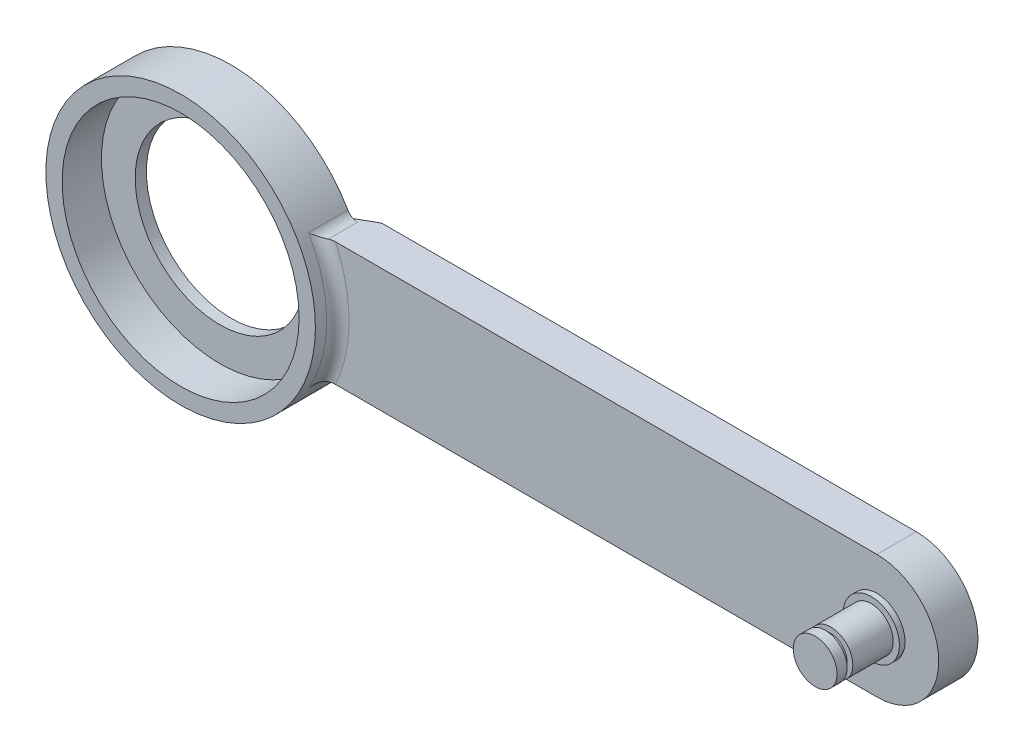
ISO-10303-21;
HEADER;
FILE_DESCRIPTION(('STEP AP214'),'2;1');
FILE_NAME('part.step','',(''),(''),'','','');
FILE_SCHEMA(('AUTOMOTIVE_DESIGN { 1 0 10303 214 1 1 1 1 }'));
ENDSEC;
DATA;
#1=APPLICATION_CONTEXT('core data for automotive mechanical design processes');
#2=APPLICATION_PROTOCOL_DEFINITION('international standard','automotive_design',2000,#1);
#3=PRODUCT_CONTEXT('',#1,'mechanical');
#4=PRODUCT('Part','Part','',(#3));
#5=PRODUCT_RELATED_PRODUCT_CATEGORY('part','',(#4));
#6=PRODUCT_DEFINITION_FORMATION('','',#4);
#7=PRODUCT_DEFINITION_CONTEXT('part definition',#1,'design');
#8=PRODUCT_DEFINITION('design','',#6,#7);
#9=PRODUCT_DEFINITION_SHAPE('','',#8);
#10=(LENGTH_UNIT() NAMED_UNIT(*) SI_UNIT(.MILLI.,.METRE.));
#11=(NAMED_UNIT(*) PLANE_ANGLE_UNIT() SI_UNIT($,.RADIAN.));
#12=(NAMED_UNIT(*) SI_UNIT($,.STERADIAN.) SOLID_ANGLE_UNIT());
#13=UNCERTAINTY_MEASURE_WITH_UNIT(LENGTH_MEASURE(1.E-05),#10,'distance_accuracy_value','');
#14=(GEOMETRIC_REPRESENTATION_CONTEXT(3) GLOBAL_UNCERTAINTY_ASSIGNED_CONTEXT((#13)) GLOBAL_UNIT_ASSIGNED_CONTEXT((#10,
#11,#12)) REPRESENTATION_CONTEXT('',''));
#15=CARTESIAN_POINT('',(0.,0.,0.));
#16=DIRECTION('',(0.,0.,1.));
#17=DIRECTION('',(1.,0.,0.));
#18=AXIS2_PLACEMENT_3D('',#15,#16,#17);
#19=CARTESIAN_POINT('',(120.,0.,16.));
#20=DIRECTION('',(0.,0.,-1.));
#21=DIRECTION('',(-1.,0.,0.));
#22=AXIS2_PLACEMENT_3D('',#19,#20,#21);
#23=CYLINDRICAL_SURFACE('',#22,3.9);
#24=CARTESIAN_POINT('',(120.,0.,6.));
#25=DIRECTION('',(0.,0.,1.));
#26=DIRECTION('',(1.,0.,0.));
#27=AXIS2_PLACEMENT_3D('',#24,#25,#26);
#28=CIRCLE('',#27,3.9);
#29=CARTESIAN_POINT('',(123.9,0.,6.));
#30=VERTEX_POINT('',#29);
#31=EDGE_CURVE('E11',#30,#30,#28,.T.);
#32=ORIENTED_EDGE('',*,*,#31,.T.);
#33=EDGE_LOOP('',(#32));
#34=FACE_BOUND('',#33,.T.);
#35=CARTESIAN_POINT('',(120.,0.,13.2));
#36=DIRECTION('',(0.,0.,1.));
#37=DIRECTION('',(1.,0.,0.));
#38=AXIS2_PLACEMENT_3D('',#35,#36,#37);
#39=CIRCLE('',#38,3.9);
#40=CARTESIAN_POINT('',(123.9,0.,13.2));
#41=VERTEX_POINT('',#40);
#42=EDGE_CURVE('E281',#41,#41,#39,.T.);
#43=ORIENTED_EDGE('',*,*,#42,.F.);
#44=EDGE_LOOP('',(#43));
#45=FACE_BOUND('',#44,.T.);
#46=ADVANCED_FACE('F38',(#34,#45),#23,.T.);
#47=CARTESIAN_POINT('',(120.,0.,0.));
#48=DIRECTION('',(0.,0.,1.));
#49=DIRECTION('',(1.,0.,0.));
#50=AXIS2_PLACEMENT_3D('',#47,#48,#49);
#51=PLANE('',#50);
#52=CARTESIAN_POINT('',(0.,0.,0.));
#53=DIRECTION('',(0.,0.,1.));
#54=DIRECTION('',(1.,0.,0.));
#55=AXIS2_PLACEMENT_3D('',#52,#53,#54);
#56=CIRCLE('',#55,15.1);
#57=CARTESIAN_POINT('',(15.1,0.,0.));
#58=VERTEX_POINT('',#57);
#59=EDGE_CURVE('E171',#58,#58,#56,.T.);
#60=ORIENTED_EDGE('',*,*,#59,.T.);
#61=EDGE_LOOP('',(#60));
#62=FACE_BOUND('',#61,.T.);
#63=DIRECTION('',(1.,0.,0.));
#64=VECTOR('',#63,1.);
#65=CARTESIAN_POINT('',(120.,11.,0.));
#66=LINE('',#65,#64);
#67=CARTESIAN_POINT('',(21.0627798152704,11.,0.));
#68=VERTEX_POINT('',#67);
#69=CARTESIAN_POINT('',(22.5166604983954,11.,0.));
#70=VERTEX_POINT('',#69);
#71=EDGE_CURVE('E54',#68,#70,#66,.T.);
#72=ORIENTED_EDGE('',*,*,#71,.F.);
#73=DIRECTION('',(0.,1.,0.));
#74=VECTOR('',#73,1.);
#75=CARTESIAN_POINT('',(21.0627798152704,0.,0.));
#76=LINE('',#75,#74);
#77=CARTESIAN_POINT('',(21.0627798152704,-10.9999999999999,0.));
#78=VERTEX_POINT('',#77);
#79=EDGE_CURVE('E326',#68,#78,#76,.F.);
#80=ORIENTED_EDGE('',*,*,#79,.T.);
#81=DIRECTION('',(-1.,0.,0.));
#82=VECTOR('',#81,1.);
#83=CARTESIAN_POINT('',(120.,-11.,0.));
#84=LINE('',#83,#82);
#85=CARTESIAN_POINT('',(22.5166604983955,-10.9999999999999,0.));
#86=VERTEX_POINT('',#85);
#87=EDGE_CURVE('E62',#86,#78,#84,.T.);
#88=ORIENTED_EDGE('',*,*,#87,.F.);
#89=CARTESIAN_POINT('',(22.5166604983955,-12.9999999999999,0.));
#90=DIRECTION('',(0.,0.,1.));
#91=DIRECTION('',(1.,0.,0.));
#92=AXIS2_PLACEMENT_3D('',#89,#90,#91);
#93=CIRCLE('',#92,2.);
#94=CARTESIAN_POINT('',(20.7846096908266,-11.9999999999999,0.));
#95=VERTEX_POINT('',#94);
#96=EDGE_CURVE('E222',#86,#95,#93,.T.);
#97=ORIENTED_EDGE('',*,*,#96,.T.);
#98=CARTESIAN_POINT('',(0.,0.,0.));
#99=DIRECTION('',(0.,0.,1.));
#100=DIRECTION('',(1.,0.,0.));
#101=AXIS2_PLACEMENT_3D('',#98,#99,#100);
#102=CIRCLE('',#101,24.);
#103=CARTESIAN_POINT('',(20.7846096908265,12.,0.));
#104=VERTEX_POINT('',#103);
#105=EDGE_CURVE('E145',#104,#95,#102,.T.);
#106=ORIENTED_EDGE('',*,*,#105,.F.);
#107=CARTESIAN_POINT('',(22.5166604983954,13.,0.));
#108=DIRECTION('',(0.,0.,1.));
#109=DIRECTION('',(1.,0.,0.));
#110=AXIS2_PLACEMENT_3D('',#107,#108,#109);
#111=CIRCLE('',#110,2.);
#112=EDGE_CURVE('E223',#104,#70,#111,.T.);
#113=ORIENTED_EDGE('',*,*,#112,.T.);
#114=EDGE_LOOP('',(#72,#80,#88,#97,#106,#113));
#115=FACE_BOUND('',#114,.T.);
#116=ADVANCED_FACE('F251',(#62,#115),#51,.F.);
#117=CARTESIAN_POINT('',(115.204168476687,-11.,7.));
#118=DIRECTION('',(0.,1.,0.));
#119=DIRECTION('',(-1.,0.,0.));
#120=AXIS2_PLACEMENT_3D('',#117,#118,#119);
#121=PLANE('',#120);
#122=DIRECTION('',(0.86602540378444,0.,-0.499999999999998));
#123=VECTOR('',#122,1.);
#124=CARTESIAN_POINT('',(24.7948306228393,-10.9999999999999,-1.99999999999999));
#125=LINE('',#124,#123);
#126=CARTESIAN_POINT('',(21.5627798152704,-10.9999999999999,-0.133974596215559));
#127=VERTEX_POINT('',#126);
#128=CARTESIAN_POINT('',(24.5627798152705,-10.9999999999999,-1.86602540378444));
#129=VERTEX_POINT('',#128);
#130=EDGE_CURVE('E343',#127,#129,#125,.T.);
#131=ORIENTED_EDGE('',*,*,#130,.T.);
#132=CARTESIAN_POINT('',(25.0627798152705,-10.9999999999999,-1.));
#133=DIRECTION('',(0.,1.,0.));
#134=DIRECTION('',(-1.,0.,0.));
#135=AXIS2_PLACEMENT_3D('',#132,#133,#134);
#136=CIRCLE('',#135,1.);
#137=CARTESIAN_POINT('',(25.0627798152705,-11.,-2.));
#138=VERTEX_POINT('',#137);
#139=EDGE_CURVE('E329',#129,#138,#136,.F.);
#140=ORIENTED_EDGE('',*,*,#139,.T.);
#141=DIRECTION('',(-1.,0.,0.));
#142=VECTOR('',#141,1.);
#143=CARTESIAN_POINT('',(21.3307290077015,-11.,-2.));
#144=LINE('',#143,#142);
#145=CARTESIAN_POINT('',(120.,-11.,-2.));
#146=VERTEX_POINT('',#145);
#147=EDGE_CURVE('E149',#146,#138,#144,.T.);
#148=ORIENTED_EDGE('',*,*,#147,.F.);
#149=DIRECTION('',(0.,0.,-1.));
#150=VECTOR('',#149,1.);
#151=CARTESIAN_POINT('',(120.,-11.,7.));
#152=LINE('',#151,#150);
#153=CARTESIAN_POINT('',(120.,-11.,5.));
#154=VERTEX_POINT('',#153);
#155=EDGE_CURVE('E144',#154,#146,#152,.T.);
#156=ORIENTED_EDGE('',*,*,#155,.F.);
#157=DIRECTION('',(1.,0.,0.));
#158=VECTOR('',#157,1.);
#159=CARTESIAN_POINT('',(21.3307290077015,-11.,5.));
#160=LINE('',#159,#158);
#161=CARTESIAN_POINT('',(23.5584379787795,-11.,5.));
#162=VERTEX_POINT('',#161);
#163=EDGE_CURVE('E151',#162,#154,#160,.T.);
#164=ORIENTED_EDGE('',*,*,#163,.F.);
#165=CARTESIAN_POINT('',(23.5584379787795,-11.,5.));
#166=CARTESIAN_POINT('',(23.4227568732596,-10.9999999999999,4.99996219199301));
#167=CARTESIAN_POINT('',(23.2870576826256,-10.9999999999999,5.01133606132718));
#168=CARTESIAN_POINT('',(23.0191283804323,-10.9999999999999,5.05647571732942));
#169=CARTESIAN_POINT('',(22.8869066875001,-10.9999999999999,5.090291423974));
#170=CARTESIAN_POINT('',(22.62993038867,-10.9999999999999,5.17993054222429));
#171=CARTESIAN_POINT('',(22.5051844996869,-10.9999999999999,5.23577909069022));
#172=CARTESIAN_POINT('',(22.267539282161,-10.9999999999999,5.36858879543293));
#173=CARTESIAN_POINT('',(22.1546298323215,-10.9999999999999,5.44553170703517));
#174=CARTESIAN_POINT('',(21.9500588709417,-10.9999999999999,5.6149947487879));
#175=CARTESIAN_POINT('',(21.8576409216163,-10.9999999999999,5.70659718742815));
#176=CARTESIAN_POINT('',(21.6917241574734,-10.9999999999999,5.90564937295355));
#177=CARTESIAN_POINT('',(21.6182182000302,-10.9999999999999,6.01309311275409));
#178=CARTESIAN_POINT('',(21.5008836591041,-10.9999999999999,6.22850675199275));
#179=CARTESIAN_POINT('',(21.4547235792098,-10.9999999999999,6.33519429094735));
#180=CARTESIAN_POINT('',(21.401186053904,-10.9999999999999,6.5000734219475));
#181=CARTESIAN_POINT('',(21.3859610637521,-10.9999999999999,6.55581156981393));
#182=CARTESIAN_POINT('',(21.3609179562887,-10.9999999999999,6.66847888412029));
#183=CARTESIAN_POINT('',(21.3510964344485,-10.9999999999999,6.72540727710309));
#184=CARTESIAN_POINT('',(21.3396175189503,-10.9999999999999,6.81873419975954));
#185=CARTESIAN_POINT('',(21.3362839907198,-10.9999999999999,6.85493592057263));
#186=CARTESIAN_POINT('',(21.3318407385153,-10.9999999999999,6.92742303563565));
#187=CARTESIAN_POINT('',(21.3307278108267,-10.9999999999999,6.96370823361879));
#188=CARTESIAN_POINT('',(21.3307290077016,-10.9999999999999,7.00000000000001));
#189=B_SPLINE_CURVE_WITH_KNOTS('',3,(#165,#166,#167,#168,#169,#170,#171,#172,#173,#174,#175,
#176,#177,#178,#179,#180,#181,#182,#183,#184,#185,#186,#187,#188),.UNSPECIFIED.,.F.,.F.,(4,2,2,
2,2,2,2,2,2,2,2,4),(0.,0.406609629605891,0.81412677331404,1.22211019656806,1.62974185907506,
2.01793677102254,2.40598485472207,2.75257886600569,2.92570013460864,3.09871220052383,
3.207714919111,3.3165602627665),.UNSPECIFIED.);
#190=CARTESIAN_POINT('',(22.5166604983947,-10.9999999999999,5.23470541870992));
#191=VERTEX_POINT('',#190);
#192=EDGE_CURVE('E182',#162,#191,#189,.T.);
#193=ORIENTED_EDGE('',*,*,#192,.T.);
#194=DIRECTION('',(0.,0.,1.));
#195=VECTOR('',#194,1.);
#196=CARTESIAN_POINT('',(22.5166604983955,-10.9999999999999,0.));
#197=LINE('',#196,#195);
#198=EDGE_CURVE('E307',#191,#86,#197,.F.);
#199=ORIENTED_EDGE('',*,*,#198,.T.);
#200=ORIENTED_EDGE('',*,*,#87,.T.);
#201=CARTESIAN_POINT('',(21.0627798152704,-10.9999999999999,-1.));
#202=DIRECTION('',(0.,1.,0.));
#203=DIRECTION('',(-1.,0.,0.));
#204=AXIS2_PLACEMENT_3D('',#201,#202,#203);
#205=CIRCLE('',#204,1.);
#206=EDGE_CURVE('E42',#78,#127,#205,.T.);
#207=ORIENTED_EDGE('',*,*,#206,.T.);
#208=EDGE_LOOP('',(#131,#140,#148,#156,#164,#193,#199,#200,#207));
#209=FACE_BOUND('',#208,.T.);
#210=ADVANCED_FACE('F198',(#209),#121,.F.);
#211=CARTESIAN_POINT('',(120.,0.,7.));
#212=DIRECTION('',(0.,0.,-1.));
#213=DIRECTION('',(-1.,0.,0.));
#214=AXIS2_PLACEMENT_3D('',#211,#212,#213);
#215=CYLINDRICAL_SURFACE('',#214,11.);
#216=CARTESIAN_POINT('',(120.,0.,5.));
#217=DIRECTION('',(0.,0.,1.));
#218=DIRECTION('',(1.,0.,0.));
#219=AXIS2_PLACEMENT_3D('',#216,#217,#218);
#220=CIRCLE('',#219,11.);
#221=CARTESIAN_POINT('',(120.,11.,5.));
#222=VERTEX_POINT('',#221);
#223=EDGE_CURVE('E156',#154,#222,#220,.T.);
#224=ORIENTED_EDGE('',*,*,#223,.F.);
#225=ORIENTED_EDGE('',*,*,#155,.T.);
#226=CARTESIAN_POINT('',(120.,0.,-2.));
#227=DIRECTION('',(0.,0.,-1.));
#228=DIRECTION('',(-1.,0.,0.));
#229=AXIS2_PLACEMENT_3D('',#226,#227,#228);
#230=CIRCLE('',#229,11.);
#231=CARTESIAN_POINT('',(120.,11.,-2.));
#232=VERTEX_POINT('',#231);
#233=EDGE_CURVE('E129',#232,#146,#230,.T.);
#234=ORIENTED_EDGE('',*,*,#233,.F.);
#235=DIRECTION('',(0.,0.,-1.));
#236=VECTOR('',#235,1.);
#237=CARTESIAN_POINT('',(120.,11.,7.));
#238=LINE('',#237,#236);
#239=EDGE_CURVE('E138',#222,#232,#238,.T.);
#240=ORIENTED_EDGE('',*,*,#239,.F.);
#241=EDGE_LOOP('',(#224,#225,#234,#240));
#242=FACE_BOUND('',#241,.T.);
#243=ADVANCED_FACE('F147',(#242),#215,.T.);
#244=CARTESIAN_POINT('',(21.3307290077015,11.,7.));
#245=DIRECTION('',(0.,-1.,0.));
#246=DIRECTION('',(0.,0.,-1.));
#247=AXIS2_PLACEMENT_3D('',#244,#245,#246);
#248=PLANE('',#247);
#249=DIRECTION('',(1.,0.,0.));
#250=VECTOR('',#249,1.);
#251=CARTESIAN_POINT('',(21.3307290077015,11.,-2.));
#252=LINE('',#251,#250);
#253=CARTESIAN_POINT('',(25.0627798152705,11.,-2.));
#254=VERTEX_POINT('',#253);
#255=EDGE_CURVE('E124',#254,#232,#252,.T.);
#256=ORIENTED_EDGE('',*,*,#255,.F.);
#257=CARTESIAN_POINT('',(25.0627798152705,11.,-1.));
#258=DIRECTION('',(0.,-1.,0.));
#259=DIRECTION('',(0.,0.,-1.));
#260=AXIS2_PLACEMENT_3D('',#257,#258,#259);
#261=CIRCLE('',#260,1.);
#262=CARTESIAN_POINT('',(24.5627798152705,11.,-1.86602540378444));
#263=VERTEX_POINT('',#262);
#264=EDGE_CURVE('E341',#254,#263,#261,.F.);
#265=ORIENTED_EDGE('',*,*,#264,.T.);
#266=DIRECTION('',(-0.86602540378444,0.,0.499999999999998));
#267=VECTOR('',#266,1.);
#268=CARTESIAN_POINT('',(24.7948306228393,11.,-2.));
#269=LINE('',#268,#267);
#270=CARTESIAN_POINT('',(21.5627798152704,11.,-0.133974596215559));
#271=VERTEX_POINT('',#270);
#272=EDGE_CURVE('E231',#263,#271,#269,.T.);
#273=ORIENTED_EDGE('',*,*,#272,.T.);
#274=CARTESIAN_POINT('',(21.0627798152704,11.,-1.));
#275=DIRECTION('',(0.,-1.,0.));
#276=DIRECTION('',(0.,0.,-1.));
#277=AXIS2_PLACEMENT_3D('',#274,#275,#276);
#278=CIRCLE('',#277,1.);
#279=EDGE_CURVE('E328',#271,#68,#278,.T.);
#280=ORIENTED_EDGE('',*,*,#279,.T.);
#281=ORIENTED_EDGE('',*,*,#71,.T.);
#282=DIRECTION('',(0.,0.,1.));
#283=VECTOR('',#282,1.);
#284=CARTESIAN_POINT('',(22.5166604983954,11.,7.));
#285=LINE('',#284,#283);
#286=CARTESIAN_POINT('',(22.5166604983954,11.,5.23470541870954));
#287=VERTEX_POINT('',#286);
#288=EDGE_CURVE('E312',#70,#287,#285,.T.);
#289=ORIENTED_EDGE('',*,*,#288,.T.);
#290=CARTESIAN_POINT('',(21.3307290077015,11.,7.));
#291=CARTESIAN_POINT('',(21.3307193888394,11.,6.94811639500716));
#292=CARTESIAN_POINT('',(21.3330003473807,11.,6.8962375553123));
#293=CARTESIAN_POINT('',(21.3420696550983,11.,6.79289042784514));
#294=CARTESIAN_POINT('',(21.3488566578645,11.,6.7414220220824));
#295=CARTESIAN_POINT('',(21.3668300410858,11.,6.63946008309144));
#296=CARTESIAN_POINT('',(21.377999548922,11.,6.5889635810875));
#297=CARTESIAN_POINT('',(21.4045906157132,11.,6.48911573032431));
#298=CARTESIAN_POINT('',(21.4200123341141,11.,6.43976442458195));
#299=CARTESIAN_POINT('',(21.472381545929,11.,6.29401065448682));
#300=CARTESIAN_POINT('',(21.5154634087046,11.,6.19973991516998));
#301=CARTESIAN_POINT('',(21.6161442295143,11.,6.01933155186743));
#302=CARTESIAN_POINT('',(21.6737538027951,11.,5.93319993859706));
#303=CARTESIAN_POINT('',(21.8043843206601,11.,5.76693701973914));
#304=CARTESIAN_POINT('',(21.877998352789,11.,5.68727239679494));
#305=CARTESIAN_POINT('',(22.036398836704,11.,5.5400044752512));
#306=CARTESIAN_POINT('',(22.1211883564247,11.,5.47240450072173));
#307=CARTESIAN_POINT('',(22.3090070001753,11.,5.34370464358101));
#308=CARTESIAN_POINT('',(22.4130165417996,11.,5.28403568828502));
#309=CARTESIAN_POINT('',(22.6289508089443,11.,5.18124888181577));
#310=CARTESIAN_POINT('',(22.7408806668299,11.,5.138141881273));
#311=CARTESIAN_POINT('',(22.9692550730866,11.,5.06920927021254));
#312=CARTESIAN_POINT('',(23.0856717106992,11.,5.04329081191872));
#313=CARTESIAN_POINT('',(23.32087593131,11.,5.00868701089776));
#314=CARTESIAN_POINT('',(23.4396600206979,11.,4.99997793581869));
#315=CARTESIAN_POINT('',(23.5584379787795,11.,5.));
#316=B_SPLINE_CURVE_WITH_KNOTS('',3,(#290,#291,#292,#293,#294,#295,#296,#297,#298,#299,#300,
#301,#302,#303,#304,#305,#306,#307,#308,#309,#310,#311,#312,#313,#314,#315),.UNSPECIFIED.,.F.,
.F.,(4,2,2,2,2,2,2,2,2,2,2,2,4),(0.,0.155592682246132,0.311138894169922,0.466092039289543,
0.621050995506262,0.930462042552343,1.24009983145372,1.56416736684727,1.88832405243608,
2.24656615792265,2.60504256854686,2.96156646432628,3.31759835688933),.UNSPECIFIED.);
#317=CARTESIAN_POINT('',(23.5584379787795,11.,5.));
#318=VERTEX_POINT('',#317);
#319=EDGE_CURVE('E191',#287,#318,#316,.T.);
#320=ORIENTED_EDGE('',*,*,#319,.T.);
#321=DIRECTION('',(-1.,0.,0.));
#322=VECTOR('',#321,1.);
#323=CARTESIAN_POINT('',(21.3307290077015,11.,5.));
#324=LINE('',#323,#322);
#325=EDGE_CURVE('E141',#222,#318,#324,.T.);
#326=ORIENTED_EDGE('',*,*,#325,.F.);
#327=ORIENTED_EDGE('',*,*,#239,.T.);
#328=EDGE_LOOP('',(#256,#265,#273,#280,#281,#289,#320,#326,#327));
#329=FACE_BOUND('',#328,.T.);
#330=ADVANCED_FACE('F139',(#329),#248,.F.);
#331=CARTESIAN_POINT('',(0.,0.,0.));
#332=DIRECTION('',(0.,0.,1.));
#333=DIRECTION('',(1.,0.,0.));
#334=AXIS2_PLACEMENT_3D('',#331,#332,#333);
#335=CYLINDRICAL_SURFACE('',#334,15.1);
#336=ORIENTED_EDGE('',*,*,#59,.F.);
#337=EDGE_LOOP('',(#336));
#338=FACE_BOUND('',#337,.T.);
#339=CARTESIAN_POINT('',(0.,0.,2.));
#340=DIRECTION('',(0.,0.,1.));
#341=DIRECTION('',(1.,0.,0.));
#342=AXIS2_PLACEMENT_3D('',#339,#340,#341);
#343=CIRCLE('',#342,15.1);
#344=CARTESIAN_POINT('',(15.1,0.,2.));
#345=VERTEX_POINT('',#344);
#346=EDGE_CURVE('E165',#345,#345,#343,.T.);
#347=ORIENTED_EDGE('',*,*,#346,.T.);
#348=EDGE_LOOP('',(#347));
#349=FACE_BOUND('',#348,.T.);
#350=ADVANCED_FACE('F348',(#338,#349),#335,.F.);
#351=CARTESIAN_POINT('',(0.,0.,7.));
#352=DIRECTION('',(0.,0.,-1.));
#353=DIRECTION('',(-1.,0.,0.));
#354=AXIS2_PLACEMENT_3D('',#351,#352,#353);
#355=CYLINDRICAL_SURFACE('',#354,24.);
#356=CARTESIAN_POINT('',(0.,0.,7.));
#357=DIRECTION('',(0.,0.,1.));
#358=DIRECTION('',(1.,0.,0.));
#359=AXIS2_PLACEMENT_3D('',#356,#357,#358);
#360=CIRCLE('',#359,24.);
#361=CARTESIAN_POINT('',(20.7846096908266,-11.9999999999999,7.));
#362=VERTEX_POINT('',#361);
#363=CARTESIAN_POINT('',(20.7846096908265,12.,7.));
#364=VERTEX_POINT('',#363);
#365=EDGE_CURVE('E180',#362,#364,#360,.T.);
#366=ORIENTED_EDGE('',*,*,#365,.T.);
#367=DIRECTION('',(0.,0.,-1.));
#368=VECTOR('',#367,1.);
#369=CARTESIAN_POINT('',(20.7846096908265,12.,7.));
#370=LINE('',#369,#368);
#371=EDGE_CURVE('E314',#364,#104,#370,.T.);
#372=ORIENTED_EDGE('',*,*,#371,.T.);
#373=ORIENTED_EDGE('',*,*,#105,.T.);
#374=DIRECTION('',(0.,0.,-1.));
#375=VECTOR('',#374,1.);
#376=CARTESIAN_POINT('',(20.7846096908266,-11.9999999999999,7.));
#377=LINE('',#376,#375);
#378=EDGE_CURVE('E316',#95,#362,#377,.F.);
#379=ORIENTED_EDGE('',*,*,#378,.T.);
#380=EDGE_LOOP('',(#366,#372,#373,#379));
#381=FACE_BOUND('',#380,.T.);
#382=CARTESIAN_POINT('',(0.,0.,9.));
#383=DIRECTION('',(0.,0.,1.));
#384=DIRECTION('',(1.,0.,0.));
#385=AXIS2_PLACEMENT_3D('',#382,#383,#384);
#386=CIRCLE('',#385,24.);
#387=CARTESIAN_POINT('',(24.,0.,9.));
#388=VERTEX_POINT('',#387);
#389=EDGE_CURVE('E162',#388,#388,#386,.T.);
#390=ORIENTED_EDGE('',*,*,#389,.F.);
#391=EDGE_LOOP('',(#390));
#392=FACE_BOUND('',#391,.T.);
#393=ADVANCED_FACE('F322',(#381,#392),#355,.T.);
#394=CARTESIAN_POINT('',(0.,0.,2.));
#395=DIRECTION('',(0.,0.,1.));
#396=DIRECTION('',(1.,0.,0.));
#397=AXIS2_PLACEMENT_3D('',#394,#395,#396);
#398=CYLINDRICAL_SURFACE('',#397,21.1);
#399=CARTESIAN_POINT('',(0.,0.,2.));
#400=DIRECTION('',(0.,0.,1.));
#401=DIRECTION('',(1.,0.,0.));
#402=AXIS2_PLACEMENT_3D('',#399,#400,#401);
#403=CIRCLE('',#402,21.1);
#404=CARTESIAN_POINT('',(21.1,0.,2.));
#405=VERTEX_POINT('',#404);
#406=EDGE_CURVE('E168',#405,#405,#403,.T.);
#407=ORIENTED_EDGE('',*,*,#406,.F.);
#408=EDGE_LOOP('',(#407));
#409=FACE_BOUND('',#408,.T.);
#410=CARTESIAN_POINT('',(0.,0.,9.));
#411=DIRECTION('',(0.,0.,1.));
#412=DIRECTION('',(1.,0.,0.));
#413=AXIS2_PLACEMENT_3D('',#410,#411,#412);
#414=CIRCLE('',#413,21.1);
#415=CARTESIAN_POINT('',(21.1,0.,9.));
#416=VERTEX_POINT('',#415);
#417=EDGE_CURVE('E159',#416,#416,#414,.T.);
#418=ORIENTED_EDGE('',*,*,#417,.T.);
#419=EDGE_LOOP('',(#418));
#420=FACE_BOUND('',#419,.T.);
#421=ADVANCED_FACE('F347',(#409,#420),#398,.F.);
#422=CARTESIAN_POINT('',(0.,0.,2.));
#423=DIRECTION('',(0.,0.,1.));
#424=DIRECTION('',(1.,0.,0.));
#425=AXIS2_PLACEMENT_3D('',#422,#423,#424);
#426=PLANE('',#425);
#427=ORIENTED_EDGE('',*,*,#346,.F.);
#428=EDGE_LOOP('',(#427));
#429=FACE_BOUND('',#428,.T.);
#430=ORIENTED_EDGE('',*,*,#406,.T.);
#431=EDGE_LOOP('',(#430));
#432=FACE_BOUND('',#431,.T.);
#433=ADVANCED_FACE('F354',(#429,#432),#426,.T.);
#434=CARTESIAN_POINT('',(0.,0.,9.));
#435=DIRECTION('',(0.,0.,1.));
#436=DIRECTION('',(1.,0.,0.));
#437=AXIS2_PLACEMENT_3D('',#434,#435,#436);
#438=PLANE('',#437);
#439=ORIENTED_EDGE('',*,*,#389,.T.);
#440=EDGE_LOOP('',(#439));
#441=FACE_BOUND('',#440,.T.);
#442=ORIENTED_EDGE('',*,*,#417,.F.);
#443=EDGE_LOOP('',(#442));
#444=FACE_BOUND('',#443,.T.);
#445=ADVANCED_FACE('F298',(#441,#444),#438,.T.);
#446=CARTESIAN_POINT('',(0.,0.,5.));
#447=DIRECTION('',(0.,0.,1.));
#448=DIRECTION('',(1.,0.,0.));
#449=AXIS2_PLACEMENT_3D('',#446,#447,#448);
#450=PLANE('',#449);
#451=CARTESIAN_POINT('',(120.,0.,5.));
#452=DIRECTION('',(0.,0.,1.));
#453=DIRECTION('',(1.,0.,0.));
#454=AXIS2_PLACEMENT_3D('',#451,#452,#453);
#455=CIRCLE('',#454,5.);
#456=CARTESIAN_POINT('',(125.,0.,5.));
#457=VERTEX_POINT('',#456);
#458=EDGE_CURVE('E278',#457,#457,#455,.T.);
#459=ORIENTED_EDGE('',*,*,#458,.F.);
#460=EDGE_LOOP('',(#459));
#461=FACE_BOUND('',#460,.T.);
#462=ORIENTED_EDGE('',*,*,#325,.T.);
#463=CARTESIAN_POINT('',(0.,0.,5.));
#464=DIRECTION('',(0.,0.,1.));
#465=DIRECTION('',(1.,0.,0.));
#466=AXIS2_PLACEMENT_3D('',#463,#464,#465);
#467=CIRCLE('',#466,26.);
#468=EDGE_CURVE('E177',#318,#162,#467,.F.);
#469=ORIENTED_EDGE('',*,*,#468,.T.);
#470=ORIENTED_EDGE('',*,*,#163,.T.);
#471=ORIENTED_EDGE('',*,*,#223,.T.);
#472=EDGE_LOOP('',(#462,#469,#470,#471));
#473=FACE_BOUND('',#472,.T.);
#474=ADVANCED_FACE('F295',(#461,#473),#450,.T.);
#475=CARTESIAN_POINT('',(120.,0.,-2.));
#476=DIRECTION('',(0.,0.,-1.));
#477=DIRECTION('',(-1.,0.,0.));
#478=AXIS2_PLACEMENT_3D('',#475,#476,#477);
#479=PLANE('',#478);
#480=ORIENTED_EDGE('',*,*,#147,.T.);
#481=DIRECTION('',(0.,1.,0.));
#482=VECTOR('',#481,1.);
#483=CARTESIAN_POINT('',(25.0627798152705,0.,-2.));
#484=LINE('',#483,#482);
#485=EDGE_CURVE('E132',#138,#254,#484,.T.);
#486=ORIENTED_EDGE('',*,*,#485,.T.);
#487=ORIENTED_EDGE('',*,*,#255,.T.);
#488=ORIENTED_EDGE('',*,*,#233,.T.);
#489=EDGE_LOOP('',(#480,#486,#487,#488));
#490=FACE_BOUND('',#489,.T.);
#491=ADVANCED_FACE('F127',(#490),#479,.T.);
#492=CARTESIAN_POINT('',(0.,0.,7.));
#493=DIRECTION('',(0.,0.,1.));
#494=DIRECTION('',(1.,0.,0.));
#495=AXIS2_PLACEMENT_3D('',#492,#493,#494);
#496=TOROIDAL_SURFACE('',#495,26.,2.);
#497=ORIENTED_EDGE('',*,*,#319,.F.);
#498=CARTESIAN_POINT('',(22.5166604983954,11.,5.23470541870954));
#499=CARTESIAN_POINT('',(22.4559061047672,11.0000061296441,5.26377912189685));
#500=CARTESIAN_POINT('',(22.3962415577045,11.002766978274,5.29490339547858));
#501=CARTESIAN_POINT('',(22.2794491910955,11.0132525244245,5.36059433929814));
#502=CARTESIAN_POINT('',(22.2223161869752,11.0209665229214,5.3951534544582));
#503=CARTESIAN_POINT('',(22.0559382690576,11.0505515765023,5.50250750811559));
#504=CARTESIAN_POINT('',(21.9505377586695,11.0788873194348,5.57956152289759));
#505=CARTESIAN_POINT('',(21.7844177743225,11.1375315667321,5.71422363811482));
#506=CARTESIAN_POINT('',(21.7205232745968,11.1640279694065,5.76974281819319));
#507=CARTESIAN_POINT('',(21.5976811062645,11.2223346676125,5.8834267656093));
#508=CARTESIAN_POINT('',(21.5387346029633,11.2541462096697,5.94159215121055));
#509=CARTESIAN_POINT('',(21.3688058991019,11.3568261618995,6.11957217168071));
#510=CARTESIAN_POINT('',(21.2652173493773,11.4347592652539,6.24246927342252));
#511=CARTESIAN_POINT('',(21.0942844687294,11.5901432058464,6.47005610827441));
#512=CARTESIAN_POINT('',(21.0237711095336,11.6651969844564,6.57408006056703));
#513=CARTESIAN_POINT('',(20.8958830347474,11.8238114051377,6.78328074757714));
#514=CARTESIAN_POINT('',(20.8384738993398,11.9073489088696,6.88845368387791));
#515=CARTESIAN_POINT('',(20.7866780405289,11.9964239223794,6.99570016389944));
#516=CARTESIAN_POINT('',(20.7856424729848,11.998211178634,6.99785010131546));
#517=CARTESIAN_POINT('',(20.7846096908265,12.,7.));
#518=B_SPLINE_CURVE_WITH_KNOTS('',3,(#498,#499,#500,#501,#502,#503,#504,#505,#506,#507,#508,
#509,#510,#511,#512,#513,#514,#515,#516,#517),.UNSPECIFIED.,.F.,.F.,(4,2,2,2,2,2,2,2,2,4),(0.,
0.201805039852146,0.403175631596912,0.802035742360274,1.06782593590826,1.33367855124534,
1.86732030276867,2.30570662869132,2.74292787910952,2.75187215617161),.UNSPECIFIED.);
#519=EDGE_CURVE('E214',#287,#364,#518,.T.);
#520=ORIENTED_EDGE('',*,*,#519,.T.);
#521=ORIENTED_EDGE('',*,*,#365,.F.);
#522=CARTESIAN_POINT('',(22.5166604983955,-10.9999999999999,5.23470541870992));
#523=CARTESIAN_POINT('',(22.4559061047671,-11.000006129644,5.26377912189704));
#524=CARTESIAN_POINT('',(22.3962415577045,-11.0027669782738,5.29490339547869));
#525=CARTESIAN_POINT('',(22.2794491910954,-11.0132525244244,5.36059433929819));
#526=CARTESIAN_POINT('',(22.2223161869751,-11.0209665229213,5.39515345445828));
#527=CARTESIAN_POINT('',(22.0559382690575,-11.0505515765022,5.5025075081157));
#528=CARTESIAN_POINT('',(21.9505377586695,-11.0788873194347,5.57956152289769));
#529=CARTESIAN_POINT('',(21.7844177743224,-11.137531566732,5.7142236381149));
#530=CARTESIAN_POINT('',(21.7205232745967,-11.1640279694064,5.76974281819328));
#531=CARTESIAN_POINT('',(21.5976811062644,-11.2223346676125,5.88342676560941));
#532=CARTESIAN_POINT('',(21.5387346029632,-11.2541462096696,5.94159215121068));
#533=CARTESIAN_POINT('',(21.3688058991018,-11.3568261618995,6.11957217168076));
#534=CARTESIAN_POINT('',(21.2652173493771,-11.4347592652542,6.24246927342232));
#535=CARTESIAN_POINT('',(21.0942844687295,-11.5901432058461,6.47005610827477));
#536=CARTESIAN_POINT('',(21.023771109534,-11.6651969844555,6.57408006056803));
#537=CARTESIAN_POINT('',(20.895883034747,-11.8238114051384,6.78328074757627));
#538=CARTESIAN_POINT('',(20.8384738993382,-11.9073489088726,6.88845368387456));
#539=CARTESIAN_POINT('',(20.7866780405289,-11.9964239223794,6.9957001638993));
#540=CARTESIAN_POINT('',(20.7856424729848,-11.9982111786339,6.99785010131539));
#541=CARTESIAN_POINT('',(20.7846096908266,-11.9999999999999,7.));
#542=B_SPLINE_CURVE_WITH_KNOTS('',3,(#522,#523,#524,#525,#526,#527,#528,#529,#530,#531,#532,
#533,#534,#535,#536,#537,#538,#539,#540,#541),.UNSPECIFIED.,.F.,.F.,(4,2,2,2,2,2,2,2,2,4),(0.,
0.20180503985216,0.403175631596926,0.802035742360252,1.06782593590824,1.33367855124534,
1.8673203027687,2.30570662869125,2.74292787910936,2.75187215617145),.UNSPECIFIED.);
#543=EDGE_CURVE('E225',#362,#191,#542,.F.);
#544=ORIENTED_EDGE('',*,*,#543,.T.);
#545=ORIENTED_EDGE('',*,*,#192,.F.);
#546=ORIENTED_EDGE('',*,*,#468,.F.);
#547=EDGE_LOOP('',(#497,#520,#521,#544,#545,#546));
#548=FACE_BOUND('',#547,.T.);
#549=ADVANCED_FACE('F201',(#548),#496,.F.);
#550=CARTESIAN_POINT('',(22.5166604983954,13.,7.));
#551=DIRECTION('',(0.,0.,-1.));
#552=DIRECTION('',(-1.,0.,0.));
#553=AXIS2_PLACEMENT_3D('',#550,#551,#552);
#554=CYLINDRICAL_SURFACE('',#553,2.);
#555=ORIENTED_EDGE('',*,*,#519,.F.);
#556=ORIENTED_EDGE('',*,*,#288,.F.);
#557=ORIENTED_EDGE('',*,*,#112,.F.);
#558=ORIENTED_EDGE('',*,*,#371,.F.);
#559=EDGE_LOOP('',(#555,#556,#557,#558));
#560=FACE_BOUND('',#559,.T.);
#561=ADVANCED_FACE('F205',(#560),#554,.F.);
#562=CARTESIAN_POINT('',(22.5166604983955,-12.9999999999999,7.));
#563=DIRECTION('',(0.,0.,-1.));
#564=DIRECTION('',(-1.,0.,0.));
#565=AXIS2_PLACEMENT_3D('',#562,#563,#564);
#566=CYLINDRICAL_SURFACE('',#565,2.);
#567=ORIENTED_EDGE('',*,*,#543,.F.);
#568=ORIENTED_EDGE('',*,*,#378,.F.);
#569=ORIENTED_EDGE('',*,*,#96,.F.);
#570=ORIENTED_EDGE('',*,*,#198,.F.);
#571=EDGE_LOOP('',(#567,#568,#569,#570));
#572=FACE_BOUND('',#571,.T.);
#573=ADVANCED_FACE('F233',(#572),#566,.F.);
#574=CARTESIAN_POINT('',(24.7948306228393,0.,-2.));
#575=DIRECTION('',(-0.499999999999998,0.,-0.86602540378444));
#576=DIRECTION('',(0.,-1.,0.));
#577=AXIS2_PLACEMENT_3D('',#574,#575,#576);
#578=PLANE('',#577);
#579=ORIENTED_EDGE('',*,*,#272,.F.);
#580=DIRECTION('',(0.,1.,0.));
#581=VECTOR('',#580,1.);
#582=CARTESIAN_POINT('',(24.5627798152705,0.,-1.86602540378444));
#583=LINE('',#582,#581);
#584=EDGE_CURVE('E338',#263,#129,#583,.F.);
#585=ORIENTED_EDGE('',*,*,#584,.T.);
#586=ORIENTED_EDGE('',*,*,#130,.F.);
#587=DIRECTION('',(0.,1.,0.));
#588=VECTOR('',#587,1.);
#589=CARTESIAN_POINT('',(21.5627798152704,0.,-0.133974596215559));
#590=LINE('',#589,#588);
#591=EDGE_CURVE('E333',#127,#271,#590,.T.);
#592=ORIENTED_EDGE('',*,*,#591,.T.);
#593=EDGE_LOOP('',(#579,#585,#586,#592));
#594=FACE_BOUND('',#593,.T.);
#595=ADVANCED_FACE('F237',(#594),#578,.T.);
#596=CARTESIAN_POINT('',(25.0627798152705,0.,-1.));
#597=DIRECTION('',(0.,1.,0.));
#598=DIRECTION('',(-1.,0.,0.));
#599=AXIS2_PLACEMENT_3D('',#596,#597,#598);
#600=CYLINDRICAL_SURFACE('',#599,1.);
#601=ORIENTED_EDGE('',*,*,#139,.F.);
#602=ORIENTED_EDGE('',*,*,#584,.F.);
#603=ORIENTED_EDGE('',*,*,#264,.F.);
#604=ORIENTED_EDGE('',*,*,#485,.F.);
#605=EDGE_LOOP('',(#601,#602,#603,#604));
#606=FACE_BOUND('',#605,.T.);
#607=ADVANCED_FACE('F240',(#606),#600,.T.);
#608=CARTESIAN_POINT('',(21.0627798152704,0.,-1.));
#609=DIRECTION('',(0.,1.,0.));
#610=DIRECTION('',(-1.,0.,0.));
#611=AXIS2_PLACEMENT_3D('',#608,#609,#610);
#612=CYLINDRICAL_SURFACE('',#611,1.);
#613=ORIENTED_EDGE('',*,*,#206,.F.);
#614=ORIENTED_EDGE('',*,*,#79,.F.);
#615=ORIENTED_EDGE('',*,*,#279,.F.);
#616=ORIENTED_EDGE('',*,*,#591,.F.);
#617=EDGE_LOOP('',(#613,#614,#615,#616));
#618=FACE_BOUND('',#617,.T.);
#619=ADVANCED_FACE('F40',(#618),#612,.F.);
#620=CARTESIAN_POINT('',(120.,0.,6.));
#621=DIRECTION('',(0.,0.,-1.));
#622=DIRECTION('',(-1.,0.,0.));
#623=AXIS2_PLACEMENT_3D('',#620,#621,#622);
#624=CYLINDRICAL_SURFACE('',#623,5.);
#625=CARTESIAN_POINT('',(120.,0.,6.));
#626=DIRECTION('',(0.,0.,1.));
#627=DIRECTION('',(1.,0.,0.));
#628=AXIS2_PLACEMENT_3D('',#625,#626,#627);
#629=CIRCLE('',#628,5.);
#630=CARTESIAN_POINT('',(125.,0.,6.));
#631=VERTEX_POINT('',#630);
#632=EDGE_CURVE('E134',#631,#631,#629,.T.);
#633=ORIENTED_EDGE('',*,*,#632,.F.);
#634=EDGE_LOOP('',(#633));
#635=FACE_BOUND('',#634,.T.);
#636=ORIENTED_EDGE('',*,*,#458,.T.);
#637=EDGE_LOOP('',(#636));
#638=FACE_BOUND('',#637,.T.);
#639=ADVANCED_FACE('F247',(#635,#638),#624,.T.);
#640=CARTESIAN_POINT('',(120.,0.,6.));
#641=DIRECTION('',(0.,0.,1.));
#642=DIRECTION('',(1.,0.,0.));
#643=AXIS2_PLACEMENT_3D('',#640,#641,#642);
#644=PLANE('',#643);
#645=ORIENTED_EDGE('',*,*,#31,.F.);
#646=EDGE_LOOP('',(#645));
#647=FACE_BOUND('',#646,.T.);
#648=ORIENTED_EDGE('',*,*,#632,.T.);
#649=EDGE_LOOP('',(#648));
#650=FACE_BOUND('',#649,.T.);
#651=ADVANCED_FACE('F288',(#647,#650),#644,.T.);
#652=CARTESIAN_POINT('',(120.,0.,14.2));
#653=DIRECTION('',(0.,0.,1.));
#654=DIRECTION('',(1.,0.,0.));
#655=AXIS2_PLACEMENT_3D('',#652,#653,#654);
#656=PLANE('',#655);
#657=CARTESIAN_POINT('',(120.,0.,14.2));
#658=DIRECTION('',(0.,0.,1.));
#659=DIRECTION('',(1.,0.,0.));
#660=AXIS2_PLACEMENT_3D('',#657,#658,#659);
#661=CIRCLE('',#660,3.9);
#662=CARTESIAN_POINT('',(123.9,0.,14.2));
#663=VERTEX_POINT('',#662);
#664=EDGE_CURVE('E274',#663,#663,#661,.T.);
#665=ORIENTED_EDGE('',*,*,#664,.F.);
#666=EDGE_LOOP('',(#665));
#667=FACE_BOUND('',#666,.T.);
#668=CARTESIAN_POINT('',(120.,0.,14.2));
#669=DIRECTION('',(0.,0.,1.));
#670=DIRECTION('',(1.,0.,0.));
#671=AXIS2_PLACEMENT_3D('',#668,#669,#670);
#672=CIRCLE('',#671,2.9);
#673=CARTESIAN_POINT('',(122.9,0.,14.2));
#674=VERTEX_POINT('',#673);
#675=EDGE_CURVE('E540',#674,#674,#672,.T.);
#676=ORIENTED_EDGE('',*,*,#675,.T.);
#677=EDGE_LOOP('',(#676));
#678=FACE_BOUND('',#677,.T.);
#679=ADVANCED_FACE('F491',(#667,#678),#656,.F.);
#680=CARTESIAN_POINT('',(120.,0.,13.2));
#681=DIRECTION('',(0.,0.,1.));
#682=DIRECTION('',(1.,0.,0.));
#683=AXIS2_PLACEMENT_3D('',#680,#681,#682);
#684=PLANE('',#683);
#685=ORIENTED_EDGE('',*,*,#42,.T.);
#686=EDGE_LOOP('',(#685));
#687=FACE_BOUND('',#686,.T.);
#688=CARTESIAN_POINT('',(120.,0.,13.2));
#689=DIRECTION('',(0.,0.,1.));
#690=DIRECTION('',(1.,0.,0.));
#691=AXIS2_PLACEMENT_3D('',#688,#689,#690);
#692=CIRCLE('',#691,2.9);
#693=CARTESIAN_POINT('',(122.9,0.,13.2));
#694=VERTEX_POINT('',#693);
#695=EDGE_CURVE('E543',#694,#694,#692,.T.);
#696=ORIENTED_EDGE('',*,*,#695,.F.);
#697=EDGE_LOOP('',(#696));
#698=FACE_BOUND('',#697,.T.);
#699=ADVANCED_FACE('F512',(#687,#698),#684,.T.);
#700=CARTESIAN_POINT('',(120.,0.,14.2));
#701=DIRECTION('',(0.,0.,-1.));
#702=DIRECTION('',(-1.,0.,0.));
#703=AXIS2_PLACEMENT_3D('',#700,#701,#702);
#704=CYLINDRICAL_SURFACE('',#703,2.9);
#705=ORIENTED_EDGE('',*,*,#675,.F.);
#706=EDGE_LOOP('',(#705));
#707=FACE_BOUND('',#706,.T.);
#708=ORIENTED_EDGE('',*,*,#695,.T.);
#709=EDGE_LOOP('',(#708));
#710=FACE_BOUND('',#709,.T.);
#711=ADVANCED_FACE('F269',(#707,#710),#704,.T.);
#712=CARTESIAN_POINT('',(120.,0.,16.));
#713=DIRECTION('',(0.,0.,1.));
#714=DIRECTION('',(1.,0.,0.));
#715=AXIS2_PLACEMENT_3D('',#712,#713,#714);
#716=PLANE('',#715);
#717=CARTESIAN_POINT('',(120.,0.,16.));
#718=DIRECTION('',(0.,0.,1.));
#719=DIRECTION('',(1.,0.,0.));
#720=AXIS2_PLACEMENT_3D('',#717,#718,#719);
#721=CIRCLE('',#720,3.9);
#722=CARTESIAN_POINT('',(123.9,0.,16.));
#723=VERTEX_POINT('',#722);
#724=EDGE_CURVE('E277',#723,#723,#721,.T.);
#725=ORIENTED_EDGE('',*,*,#724,.T.);
#726=EDGE_LOOP('',(#725));
#727=FACE_BOUND('',#726,.T.);
#728=ADVANCED_FACE('F264',(#727),#716,.T.);
#729=ORIENTED_EDGE('',*,*,#664,.T.);
#730=EDGE_LOOP('',(#729));
#731=FACE_BOUND('',#730,.T.);
#732=ORIENTED_EDGE('',*,*,#724,.F.);
#733=EDGE_LOOP('',(#732));
#734=FACE_BOUND('',#733,.T.);
#735=ADVANCED_FACE('F254',(#731,#734),#23,.T.);
#736=CLOSED_SHELL('',(#46,#116,#210,#243,#330,#350,#393,#421,#433,#445,#474,#491,#549,#561,#573,
#595,#607,#619,#639,#651,#679,#699,#711,#728,#735));
#737=MANIFOLD_SOLID_BREP('B2',#736);
#738=ADVANCED_BREP_SHAPE_REPRESENTATION('',(#18,#737),#14);
#739=SHAPE_DEFINITION_REPRESENTATION(#9,#738);
ENDSEC;
END-ISO-10303-21;
